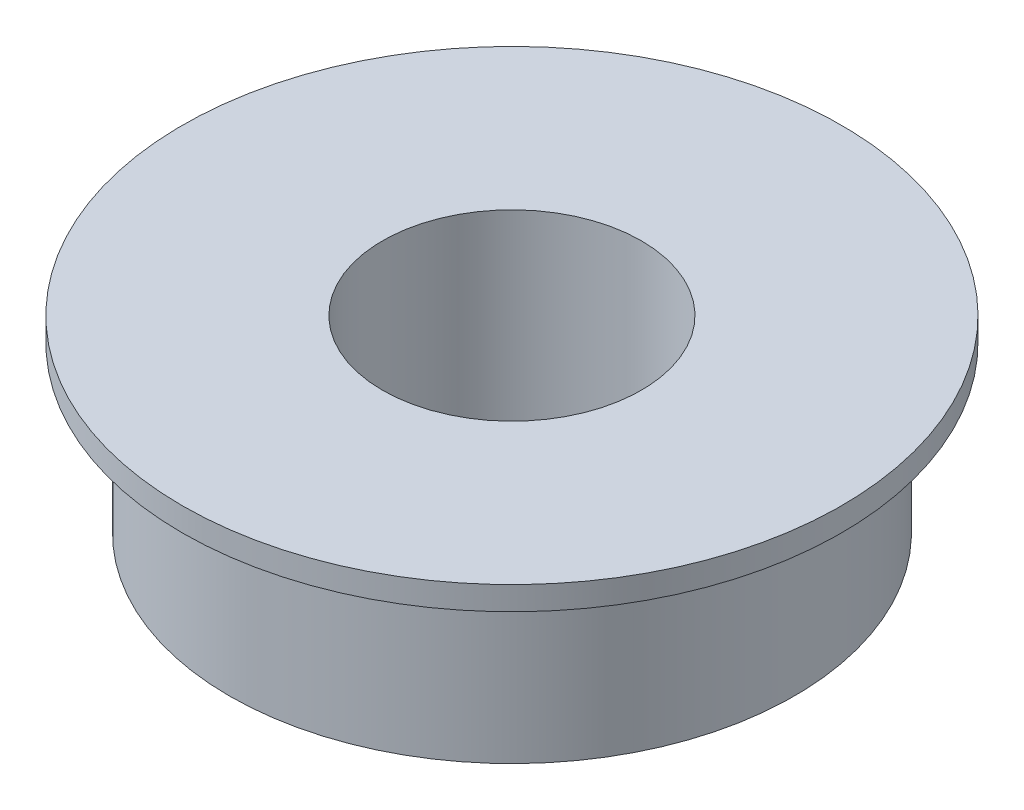
ISO-10303-21;
HEADER;
FILE_DESCRIPTION(('STEP AP214'),'2;1');
FILE_NAME('part.step','',(''),(''),'','','');
FILE_SCHEMA(('AUTOMOTIVE_DESIGN { 1 0 10303 214 1 1 1 1 }'));
ENDSEC;
DATA;
#1=APPLICATION_CONTEXT('core data for automotive mechanical design processes');
#2=APPLICATION_PROTOCOL_DEFINITION('international standard','automotive_design',2000,#1);
#3=PRODUCT_CONTEXT('',#1,'mechanical');
#4=PRODUCT('Part','Part','',(#3));
#5=PRODUCT_RELATED_PRODUCT_CATEGORY('part','',(#4));
#6=PRODUCT_DEFINITION_FORMATION('','',#4);
#7=PRODUCT_DEFINITION_CONTEXT('part definition',#1,'design');
#8=PRODUCT_DEFINITION('design','',#6,#7);
#9=PRODUCT_DEFINITION_SHAPE('','',#8);
#10=(LENGTH_UNIT() NAMED_UNIT(*) SI_UNIT(.MILLI.,.METRE.));
#11=(NAMED_UNIT(*) PLANE_ANGLE_UNIT() SI_UNIT($,.RADIAN.));
#12=(NAMED_UNIT(*) SI_UNIT($,.STERADIAN.) SOLID_ANGLE_UNIT());
#13=UNCERTAINTY_MEASURE_WITH_UNIT(LENGTH_MEASURE(1.E-05),#10,'distance_accuracy_value','');
#14=(GEOMETRIC_REPRESENTATION_CONTEXT(3) GLOBAL_UNCERTAINTY_ASSIGNED_CONTEXT((#13)) GLOBAL_UNIT_ASSIGNED_CONTEXT((#10,
#11,#12)) REPRESENTATION_CONTEXT('',''));
#15=CARTESIAN_POINT('',(0.,0.,0.));
#16=DIRECTION('',(0.,0.,1.));
#17=DIRECTION('',(1.,0.,0.));
#18=AXIS2_PLACEMENT_3D('',#15,#16,#17);
#19=CARTESIAN_POINT('',(0.,4.,0.));
#20=DIRECTION('',(0.,-1.,0.));
#21=DIRECTION('',(0.,0.,-1.));
#22=AXIS2_PLACEMENT_3D('',#19,#20,#21);
#23=CYLINDRICAL_SURFACE('',#22,6.);
#24=CARTESIAN_POINT('',(0.,0.,0.));
#25=DIRECTION('',(0.,1.,0.));
#26=DIRECTION('',(0.,0.,1.));
#27=AXIS2_PLACEMENT_3D('',#24,#25,#26);
#28=CIRCLE('',#27,6.);
#29=CARTESIAN_POINT('',(0.,0.,6.));
#30=VERTEX_POINT('',#29);
#31=EDGE_CURVE('E40',#30,#30,#28,.T.);
#32=ORIENTED_EDGE('',*,*,#31,.T.);
#33=EDGE_LOOP('',(#32));
#34=FACE_BOUND('',#33,.T.);
#35=CARTESIAN_POINT('',(0.,3.5,0.));
#36=DIRECTION('',(0.,1.,0.));
#37=DIRECTION('',(0.,0.,1.));
#38=AXIS2_PLACEMENT_3D('',#35,#36,#37);
#39=CIRCLE('',#38,6.);
#40=CARTESIAN_POINT('',(0.,3.5,6.));
#41=VERTEX_POINT('',#40);
#42=EDGE_CURVE('E10',#41,#41,#39,.T.);
#43=ORIENTED_EDGE('',*,*,#42,.F.);
#44=EDGE_LOOP('',(#43));
#45=FACE_BOUND('',#44,.T.);
#46=ADVANCED_FACE('F37',(#34,#45),#23,.T.);
#47=CARTESIAN_POINT('',(0.,4.,0.));
#48=DIRECTION('',(0.,1.,0.));
#49=DIRECTION('',(0.,0.,1.));
#50=AXIS2_PLACEMENT_3D('',#47,#48,#49);
#51=PLANE('',#50);
#52=CARTESIAN_POINT('',(0.,4.,0.));
#53=DIRECTION('',(0.,1.,0.));
#54=DIRECTION('',(0.,0.,1.));
#55=AXIS2_PLACEMENT_3D('',#52,#53,#54);
#56=CIRCLE('',#55,2.75);
#57=CARTESIAN_POINT('',(0.,4.,2.75));
#58=VERTEX_POINT('',#57);
#59=EDGE_CURVE('E48',#58,#58,#56,.T.);
#60=ORIENTED_EDGE('',*,*,#59,.F.);
#61=EDGE_LOOP('',(#60));
#62=FACE_BOUND('',#61,.T.);
#63=CARTESIAN_POINT('',(0.,4.,0.));
#64=DIRECTION('',(0.,1.,0.));
#65=DIRECTION('',(0.,0.,1.));
#66=AXIS2_PLACEMENT_3D('',#63,#64,#65);
#67=CIRCLE('',#66,7.);
#68=CARTESIAN_POINT('',(0.,4.,7.));
#69=VERTEX_POINT('',#68);
#70=EDGE_CURVE('E51',#69,#69,#67,.T.);
#71=ORIENTED_EDGE('',*,*,#70,.T.);
#72=EDGE_LOOP('',(#71));
#73=FACE_BOUND('',#72,.T.);
#74=ADVANCED_FACE('F65',(#62,#73),#51,.T.);
#75=CARTESIAN_POINT('',(0.,0.,0.));
#76=DIRECTION('',(0.,1.,0.));
#77=DIRECTION('',(0.,0.,1.));
#78=AXIS2_PLACEMENT_3D('',#75,#76,#77);
#79=PLANE('',#78);
#80=ORIENTED_EDGE('',*,*,#31,.F.);
#81=EDGE_LOOP('',(#80));
#82=FACE_BOUND('',#81,.T.);
#83=CARTESIAN_POINT('',(0.,0.,0.));
#84=DIRECTION('',(0.,1.,0.));
#85=DIRECTION('',(0.,0.,1.));
#86=AXIS2_PLACEMENT_3D('',#83,#84,#85);
#87=CIRCLE('',#86,2.75);
#88=CARTESIAN_POINT('',(0.,0.,2.75));
#89=VERTEX_POINT('',#88);
#90=EDGE_CURVE('E54',#89,#89,#87,.T.);
#91=ORIENTED_EDGE('',*,*,#90,.T.);
#92=EDGE_LOOP('',(#91));
#93=FACE_BOUND('',#92,.T.);
#94=ADVANCED_FACE('F84',(#82,#93),#79,.F.);
#95=CARTESIAN_POINT('',(0.,4.,0.));
#96=DIRECTION('',(0.,-1.,0.));
#97=DIRECTION('',(0.,0.,-1.));
#98=AXIS2_PLACEMENT_3D('',#95,#96,#97);
#99=CYLINDRICAL_SURFACE('',#98,2.75);
#100=ORIENTED_EDGE('',*,*,#59,.T.);
#101=EDGE_LOOP('',(#100));
#102=FACE_BOUND('',#101,.T.);
#103=ORIENTED_EDGE('',*,*,#90,.F.);
#104=EDGE_LOOP('',(#103));
#105=FACE_BOUND('',#104,.T.);
#106=ADVANCED_FACE('F74',(#102,#105),#99,.F.);
#107=CARTESIAN_POINT('',(0.,3.5,0.));
#108=DIRECTION('',(0.,1.,0.));
#109=DIRECTION('',(0.,0.,1.));
#110=AXIS2_PLACEMENT_3D('',#107,#108,#109);
#111=PLANE('',#110);
#112=CARTESIAN_POINT('',(0.,3.5,0.));
#113=DIRECTION('',(0.,1.,0.));
#114=DIRECTION('',(0.,0.,1.));
#115=AXIS2_PLACEMENT_3D('',#112,#113,#114);
#116=CIRCLE('',#115,7.);
#117=CARTESIAN_POINT('',(0.,3.5,7.));
#118=VERTEX_POINT('',#117);
#119=EDGE_CURVE('E56',#118,#118,#116,.T.);
#120=ORIENTED_EDGE('',*,*,#119,.F.);
#121=EDGE_LOOP('',(#120));
#122=FACE_BOUND('',#121,.T.);
#123=ORIENTED_EDGE('',*,*,#42,.T.);
#124=EDGE_LOOP('',(#123));
#125=FACE_BOUND('',#124,.T.);
#126=ADVANCED_FACE('F69',(#122,#125),#111,.F.);
#127=CARTESIAN_POINT('',(0.,3.5,0.));
#128=DIRECTION('',(0.,1.,0.));
#129=DIRECTION('',(0.,0.,1.));
#130=AXIS2_PLACEMENT_3D('',#127,#128,#129);
#131=CYLINDRICAL_SURFACE('',#130,7.);
#132=ORIENTED_EDGE('',*,*,#119,.T.);
#133=EDGE_LOOP('',(#132));
#134=FACE_BOUND('',#133,.T.);
#135=ORIENTED_EDGE('',*,*,#70,.F.);
#136=EDGE_LOOP('',(#135));
#137=FACE_BOUND('',#136,.T.);
#138=ADVANCED_FACE('F67',(#134,#137),#131,.T.);
#139=CLOSED_SHELL('',(#46,#74,#94,#106,#126,#138));
#140=MANIFOLD_SOLID_BREP('B2',#139);
#141=ADVANCED_BREP_SHAPE_REPRESENTATION('',(#18,#140),#14);
#142=SHAPE_DEFINITION_REPRESENTATION(#9,#141);
ENDSEC;
END-ISO-10303-21;
